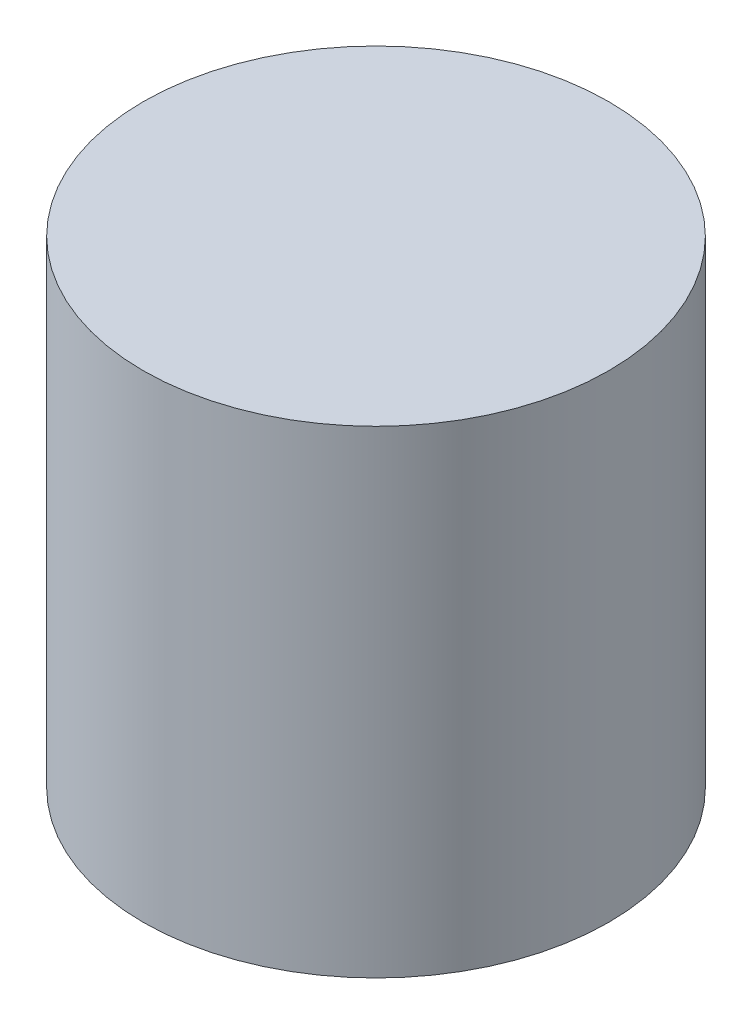
ISO-10303-21;
HEADER;
FILE_DESCRIPTION(('STEP AP214'),'2;1');
FILE_NAME('part.step','',(''),(''),'','','');
FILE_SCHEMA(('AUTOMOTIVE_DESIGN { 1 0 10303 214 1 1 1 1 }'));
ENDSEC;
DATA;
#1=APPLICATION_CONTEXT('core data for automotive mechanical design processes');
#2=APPLICATION_PROTOCOL_DEFINITION('international standard','automotive_design',2000,#1);
#3=PRODUCT_CONTEXT('',#1,'mechanical');
#4=PRODUCT('Part','Part','',(#3));
#5=PRODUCT_RELATED_PRODUCT_CATEGORY('part','',(#4));
#6=PRODUCT_DEFINITION_FORMATION('','',#4);
#7=PRODUCT_DEFINITION_CONTEXT('part definition',#1,'design');
#8=PRODUCT_DEFINITION('design','',#6,#7);
#9=PRODUCT_DEFINITION_SHAPE('','',#8);
#10=(LENGTH_UNIT() NAMED_UNIT(*) SI_UNIT(.MILLI.,.METRE.));
#11=(NAMED_UNIT(*) PLANE_ANGLE_UNIT() SI_UNIT($,.RADIAN.));
#12=(NAMED_UNIT(*) SI_UNIT($,.STERADIAN.) SOLID_ANGLE_UNIT());
#13=UNCERTAINTY_MEASURE_WITH_UNIT(LENGTH_MEASURE(1.E-05),#10,'distance_accuracy_value','');
#14=(GEOMETRIC_REPRESENTATION_CONTEXT(3) GLOBAL_UNCERTAINTY_ASSIGNED_CONTEXT((#13)) GLOBAL_UNIT_ASSIGNED_CONTEXT((#10,
#11,#12)) REPRESENTATION_CONTEXT('',''));
#15=CARTESIAN_POINT('',(0.,0.,0.));
#16=DIRECTION('',(0.,0.,1.));
#17=DIRECTION('',(1.,0.,0.));
#18=AXIS2_PLACEMENT_3D('',#15,#16,#17);
#19=CARTESIAN_POINT('',(0.,-37.,0.));
#20=DIRECTION('',(0.,1.,0.));
#21=DIRECTION('',(0.,0.,1.));
#22=AXIS2_PLACEMENT_3D('',#19,#20,#21);
#23=CYLINDRICAL_SURFACE('',#22,18.);
#24=CARTESIAN_POINT('',(0.,-33.4292857857286,0.));
#25=DIRECTION('',(0.,-1.,0.));
#26=DIRECTION('',(0.,0.,-1.));
#27=AXIS2_PLACEMENT_3D('',#24,#25,#26);
#28=CIRCLE('',#27,18.);
#29=CARTESIAN_POINT('',(0.,-33.4292857857286,-18.));
#30=VERTEX_POINT('',#29);
#31=EDGE_CURVE('E42',#30,#30,#28,.T.);
#32=ORIENTED_EDGE('',*,*,#31,.T.);
#33=EDGE_LOOP('',(#32));
#34=FACE_BOUND('',#33,.T.);
#35=CARTESIAN_POINT('',(0.,-3.,0.));
#36=DIRECTION('',(0.,1.,0.));
#37=DIRECTION('',(0.,0.,1.));
#38=AXIS2_PLACEMENT_3D('',#35,#36,#37);
#39=CIRCLE('',#38,18.);
#40=CARTESIAN_POINT('',(0.,-3.,18.));
#41=VERTEX_POINT('',#40);
#42=EDGE_CURVE('E55',#41,#41,#39,.T.);
#43=ORIENTED_EDGE('',*,*,#42,.T.);
#44=EDGE_LOOP('',(#43));
#45=FACE_BOUND('',#44,.T.);
#46=ADVANCED_FACE('F35',(#34,#45),#23,.F.);
#47=CARTESIAN_POINT('',(0.,3.,0.));
#48=DIRECTION('',(0.,-1.,0.));
#49=DIRECTION('',(0.,0.,-1.));
#50=AXIS2_PLACEMENT_3D('',#47,#48,#49);
#51=CYLINDRICAL_SURFACE('',#50,19.5);
#52=CARTESIAN_POINT('',(0.,3.,0.));
#53=DIRECTION('',(0.,1.,0.));
#54=DIRECTION('',(0.,0.,1.));
#55=AXIS2_PLACEMENT_3D('',#52,#53,#54);
#56=CIRCLE('',#55,19.5);
#57=CARTESIAN_POINT('',(0.,3.,19.5));
#58=VERTEX_POINT('',#57);
#59=EDGE_CURVE('E46',#58,#58,#56,.T.);
#60=ORIENTED_EDGE('',*,*,#59,.F.);
#61=EDGE_LOOP('',(#60));
#62=FACE_BOUND('',#61,.T.);
#63=CARTESIAN_POINT('',(0.,-37.,0.));
#64=DIRECTION('',(0.,-1.,0.));
#65=DIRECTION('',(0.,0.,-1.));
#66=AXIS2_PLACEMENT_3D('',#63,#64,#65);
#67=CIRCLE('',#66,19.5);
#68=CARTESIAN_POINT('',(0.,-37.,-19.5));
#69=VERTEX_POINT('',#68);
#70=EDGE_CURVE('E50',#69,#69,#67,.T.);
#71=ORIENTED_EDGE('',*,*,#70,.F.);
#72=EDGE_LOOP('',(#71));
#73=FACE_BOUND('',#72,.T.);
#74=ADVANCED_FACE('F77',(#62,#73),#51,.T.);
#75=CARTESIAN_POINT('',(0.,3.,0.));
#76=DIRECTION('',(0.,1.,0.));
#77=DIRECTION('',(0.,0.,1.));
#78=AXIS2_PLACEMENT_3D('',#75,#76,#77);
#79=PLANE('',#78);
#80=ORIENTED_EDGE('',*,*,#59,.T.);
#81=EDGE_LOOP('',(#80));
#82=FACE_BOUND('',#81,.T.);
#83=ADVANCED_FACE('F74',(#82),#79,.T.);
#84=CARTESIAN_POINT('',(0.,-33.4292857857286,0.));
#85=DIRECTION('',(0.,-1.,0.));
#86=DIRECTION('',(0.,0.,-1.));
#87=AXIS2_PLACEMENT_3D('',#84,#85,#86);
#88=TOROIDAL_SURFACE('',#87,23.,5.);
#89=ORIENTED_EDGE('',*,*,#70,.T.);
#90=EDGE_LOOP('',(#89));
#91=FACE_BOUND('',#90,.T.);
#92=ORIENTED_EDGE('',*,*,#31,.F.);
#93=EDGE_LOOP('',(#92));
#94=FACE_BOUND('',#93,.T.);
#95=ADVANCED_FACE('F37',(#91,#94),#88,.T.);
#96=CARTESIAN_POINT('',(0.,-3.,0.));
#97=DIRECTION('',(0.,1.,0.));
#98=DIRECTION('',(0.,0.,1.));
#99=AXIS2_PLACEMENT_3D('',#96,#97,#98);
#100=CYLINDRICAL_SURFACE('',#99,17.4);
#101=CARTESIAN_POINT('',(0.,-3.,0.));
#102=DIRECTION('',(0.,1.,0.));
#103=DIRECTION('',(0.,0.,1.));
#104=AXIS2_PLACEMENT_3D('',#101,#102,#103);
#105=CIRCLE('',#104,17.4);
#106=CARTESIAN_POINT('',(0.,-3.,17.4));
#107=VERTEX_POINT('',#106);
#108=EDGE_CURVE('E58',#107,#107,#105,.T.);
#109=ORIENTED_EDGE('',*,*,#108,.F.);
#110=EDGE_LOOP('',(#109));
#111=FACE_BOUND('',#110,.T.);
#112=CARTESIAN_POINT('',(0.,0.,0.));
#113=DIRECTION('',(0.,1.,0.));
#114=DIRECTION('',(0.,0.,1.));
#115=AXIS2_PLACEMENT_3D('',#112,#113,#114);
#116=CIRCLE('',#115,17.4);
#117=CARTESIAN_POINT('',(0.,0.,17.4));
#118=VERTEX_POINT('',#117);
#119=EDGE_CURVE('E10',#118,#118,#116,.T.);
#120=ORIENTED_EDGE('',*,*,#119,.T.);
#121=EDGE_LOOP('',(#120));
#122=FACE_BOUND('',#121,.T.);
#123=ADVANCED_FACE('F65',(#111,#122),#100,.F.);
#124=CARTESIAN_POINT('',(0.,-3.,0.));
#125=DIRECTION('',(0.,1.,0.));
#126=DIRECTION('',(0.,0.,1.));
#127=AXIS2_PLACEMENT_3D('',#124,#125,#126);
#128=PLANE('',#127);
#129=ORIENTED_EDGE('',*,*,#108,.T.);
#130=EDGE_LOOP('',(#129));
#131=FACE_BOUND('',#130,.T.);
#132=ORIENTED_EDGE('',*,*,#42,.F.);
#133=EDGE_LOOP('',(#132));
#134=FACE_BOUND('',#133,.T.);
#135=ADVANCED_FACE('F62',(#131,#134),#128,.F.);
#136=CARTESIAN_POINT('',(0.,0.,0.));
#137=DIRECTION('',(0.,1.,0.));
#138=DIRECTION('',(0.,0.,1.));
#139=AXIS2_PLACEMENT_3D('',#136,#137,#138);
#140=PLANE('',#139);
#141=ORIENTED_EDGE('',*,*,#119,.F.);
#142=EDGE_LOOP('',(#141));
#143=FACE_BOUND('',#142,.T.);
#144=ADVANCED_FACE('F72',(#143),#140,.F.);
#145=CLOSED_SHELL('',(#46,#74,#83,#95,#123,#135,#144));
#146=MANIFOLD_SOLID_BREP('B2',#145);
#147=ADVANCED_BREP_SHAPE_REPRESENTATION('',(#18,#146),#14);
#148=SHAPE_DEFINITION_REPRESENTATION(#9,#147);
ENDSEC;
END-ISO-10303-21;
